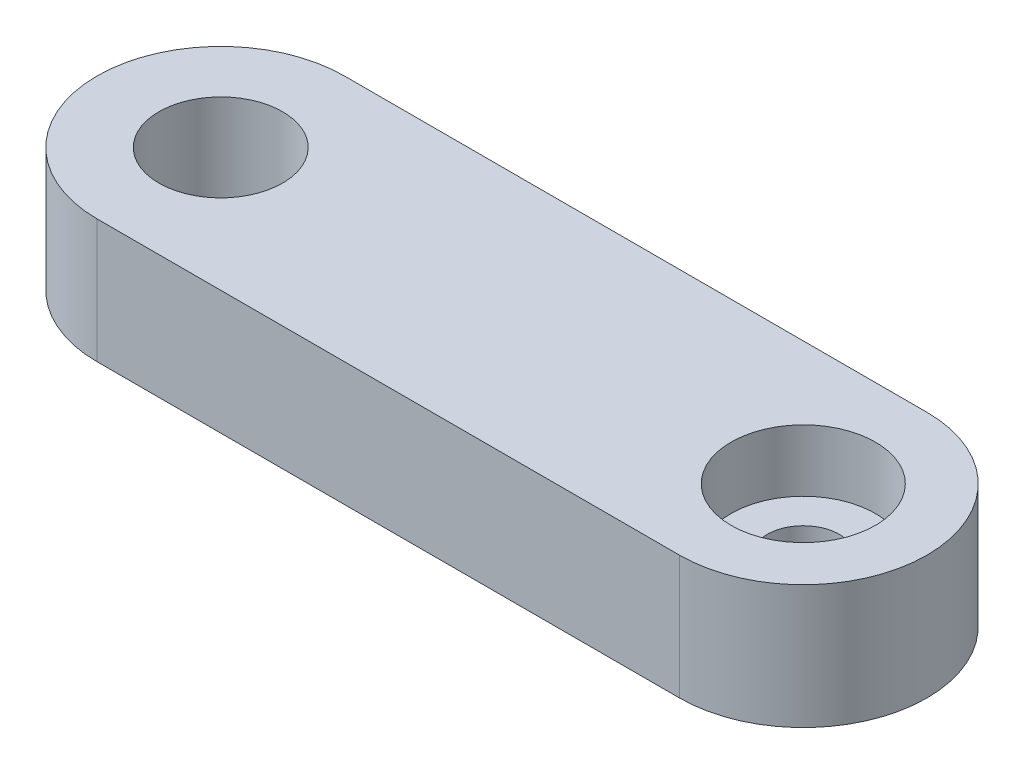
ISO-10303-21;
HEADER;
FILE_DESCRIPTION(('STEP AP214'),'2;1');
FILE_NAME('part.step','',(''),(''),'','','');
FILE_SCHEMA(('AUTOMOTIVE_DESIGN { 1 0 10303 214 1 1 1 1 }'));
ENDSEC;
DATA;
#1=APPLICATION_CONTEXT('core data for automotive mechanical design processes');
#2=APPLICATION_PROTOCOL_DEFINITION('international standard','automotive_design',2000,#1);
#3=PRODUCT_CONTEXT('',#1,'mechanical');
#4=PRODUCT('Part','Part','',(#3));
#5=PRODUCT_RELATED_PRODUCT_CATEGORY('part','',(#4));
#6=PRODUCT_DEFINITION_FORMATION('','',#4);
#7=PRODUCT_DEFINITION_CONTEXT('part definition',#1,'design');
#8=PRODUCT_DEFINITION('design','',#6,#7);
#9=PRODUCT_DEFINITION_SHAPE('','',#8);
#10=(LENGTH_UNIT() NAMED_UNIT(*) SI_UNIT(.MILLI.,.METRE.));
#11=(NAMED_UNIT(*) PLANE_ANGLE_UNIT() SI_UNIT($,.RADIAN.));
#12=(NAMED_UNIT(*) SI_UNIT($,.STERADIAN.) SOLID_ANGLE_UNIT());
#13=UNCERTAINTY_MEASURE_WITH_UNIT(LENGTH_MEASURE(1.E-05),#10,'distance_accuracy_value','');
#14=(GEOMETRIC_REPRESENTATION_CONTEXT(3) GLOBAL_UNCERTAINTY_ASSIGNED_CONTEXT((#13)) GLOBAL_UNIT_ASSIGNED_CONTEXT((#10,
#11,#12)) REPRESENTATION_CONTEXT('',''));
#15=CARTESIAN_POINT('',(0.,0.,0.));
#16=DIRECTION('',(0.,0.,1.));
#17=DIRECTION('',(1.,0.,0.));
#18=AXIS2_PLACEMENT_3D('',#15,#16,#17);
#19=CARTESIAN_POINT('',(0.,6.,0.));
#20=DIRECTION('',(0.,-1.,0.));
#21=DIRECTION('',(0.,0.,-1.));
#22=AXIS2_PLACEMENT_3D('',#19,#20,#21);
#23=CYLINDRICAL_SURFACE('',#22,1.75);
#24=CARTESIAN_POINT('',(0.,0.,0.));
#25=DIRECTION('',(0.,1.,0.));
#26=DIRECTION('',(0.,0.,1.));
#27=AXIS2_PLACEMENT_3D('',#24,#25,#26);
#28=CIRCLE('',#27,1.75);
#29=CARTESIAN_POINT('',(0.,0.,1.75));
#30=VERTEX_POINT('',#29);
#31=EDGE_CURVE('E102',#30,#30,#28,.T.);
#32=ORIENTED_EDGE('',*,*,#31,.F.);
#33=EDGE_LOOP('',(#32));
#34=FACE_BOUND('',#33,.T.);
#35=CARTESIAN_POINT('',(0.,3.,0.));
#36=DIRECTION('',(0.,1.,0.));
#37=DIRECTION('',(0.,0.,1.));
#38=AXIS2_PLACEMENT_3D('',#35,#36,#37);
#39=CIRCLE('',#38,1.75);
#40=CARTESIAN_POINT('',(0.,3.,1.75));
#41=VERTEX_POINT('',#40);
#42=EDGE_CURVE('E36',#41,#41,#39,.T.);
#43=ORIENTED_EDGE('',*,*,#42,.T.);
#44=EDGE_LOOP('',(#43));
#45=FACE_BOUND('',#44,.T.);
#46=ADVANCED_FACE('F32',(#34,#45),#23,.F.);
#47=CARTESIAN_POINT('',(0.,6.,0.));
#48=DIRECTION('',(0.,1.,0.));
#49=DIRECTION('',(0.,0.,1.));
#50=AXIS2_PLACEMENT_3D('',#47,#48,#49);
#51=PLANE('',#50);
#52=CARTESIAN_POINT('',(0.,6.,0.));
#53=DIRECTION('',(0.,1.,0.));
#54=DIRECTION('',(0.,0.,1.));
#55=AXIS2_PLACEMENT_3D('',#52,#53,#54);
#56=CIRCLE('',#55,3.5);
#57=CARTESIAN_POINT('',(0.,6.,3.5));
#58=VERTEX_POINT('',#57);
#59=EDGE_CURVE('E122',#58,#58,#56,.T.);
#60=ORIENTED_EDGE('',*,*,#59,.F.);
#61=EDGE_LOOP('',(#60));
#62=FACE_BOUND('',#61,.T.);
#63=CARTESIAN_POINT('',(0.,6.,0.));
#64=DIRECTION('',(0.,1.,0.));
#65=DIRECTION('',(0.,0.,1.));
#66=AXIS2_PLACEMENT_3D('',#63,#64,#65);
#67=CIRCLE('',#66,6.);
#68=CARTESIAN_POINT('',(0.,6.,6.));
#69=VERTEX_POINT('',#68);
#70=CARTESIAN_POINT('',(0.,6.,-6.));
#71=VERTEX_POINT('',#70);
#72=EDGE_CURVE('E86',#69,#71,#67,.T.);
#73=ORIENTED_EDGE('',*,*,#72,.T.);
#74=DIRECTION('',(-1.,0.,0.));
#75=VECTOR('',#74,1.);
#76=CARTESIAN_POINT('',(0.,6.,-6.));
#77=LINE('',#76,#75);
#78=CARTESIAN_POINT('',(-28.25,6.,-6.));
#79=VERTEX_POINT('',#78);
#80=EDGE_CURVE('E80',#71,#79,#77,.T.);
#81=ORIENTED_EDGE('',*,*,#80,.T.);
#82=CARTESIAN_POINT('',(-28.25,6.,0.));
#83=DIRECTION('',(0.,1.,0.));
#84=DIRECTION('',(0.,0.,1.));
#85=AXIS2_PLACEMENT_3D('',#82,#83,#84);
#86=CIRCLE('',#85,6.);
#87=CARTESIAN_POINT('',(-28.25,6.,6.));
#88=VERTEX_POINT('',#87);
#89=EDGE_CURVE('E84',#79,#88,#86,.T.);
#90=ORIENTED_EDGE('',*,*,#89,.T.);
#91=DIRECTION('',(1.,0.,0.));
#92=VECTOR('',#91,1.);
#93=CARTESIAN_POINT('',(0.,6.,6.));
#94=LINE('',#93,#92);
#95=EDGE_CURVE('E50',#88,#69,#94,.T.);
#96=ORIENTED_EDGE('',*,*,#95,.T.);
#97=EDGE_LOOP('',(#73,#81,#90,#96));
#98=FACE_BOUND('',#97,.T.);
#99=CARTESIAN_POINT('',(-28.25,6.,0.));
#100=DIRECTION('',(0.,1.,0.));
#101=DIRECTION('',(0.,0.,1.));
#102=AXIS2_PLACEMENT_3D('',#99,#100,#101);
#103=CIRCLE('',#102,3.);
#104=CARTESIAN_POINT('',(-28.25,6.,3.));
#105=VERTEX_POINT('',#104);
#106=EDGE_CURVE('E116',#105,#105,#103,.T.);
#107=ORIENTED_EDGE('',*,*,#106,.F.);
#108=EDGE_LOOP('',(#107));
#109=FACE_BOUND('',#108,.T.);
#110=ADVANCED_FACE('F81',(#62,#98,#109),#51,.T.);
#111=CARTESIAN_POINT('',(0.,0.,0.));
#112=DIRECTION('',(0.,1.,0.));
#113=DIRECTION('',(0.,0.,1.));
#114=AXIS2_PLACEMENT_3D('',#111,#112,#113);
#115=PLANE('',#114);
#116=ORIENTED_EDGE('',*,*,#31,.T.);
#117=EDGE_LOOP('',(#116));
#118=FACE_BOUND('',#117,.T.);
#119=CARTESIAN_POINT('',(0.,0.,0.));
#120=DIRECTION('',(0.,1.,0.));
#121=DIRECTION('',(0.,0.,1.));
#122=AXIS2_PLACEMENT_3D('',#119,#120,#121);
#123=CIRCLE('',#122,6.);
#124=CARTESIAN_POINT('',(0.,0.,6.));
#125=VERTEX_POINT('',#124);
#126=CARTESIAN_POINT('',(0.,0.,-6.));
#127=VERTEX_POINT('',#126);
#128=EDGE_CURVE('E99',#125,#127,#123,.T.);
#129=ORIENTED_EDGE('',*,*,#128,.F.);
#130=DIRECTION('',(1.,0.,0.));
#131=VECTOR('',#130,1.);
#132=CARTESIAN_POINT('',(0.,0.,6.));
#133=LINE('',#132,#131);
#134=CARTESIAN_POINT('',(-28.25,0.,6.));
#135=VERTEX_POINT('',#134);
#136=EDGE_CURVE('E73',#135,#125,#133,.T.);
#137=ORIENTED_EDGE('',*,*,#136,.F.);
#138=CARTESIAN_POINT('',(-28.25,0.,0.));
#139=DIRECTION('',(0.,1.,0.));
#140=DIRECTION('',(0.,0.,1.));
#141=AXIS2_PLACEMENT_3D('',#138,#139,#140);
#142=CIRCLE('',#141,6.);
#143=CARTESIAN_POINT('',(-28.25,0.,-6.));
#144=VERTEX_POINT('',#143);
#145=EDGE_CURVE('E67',#144,#135,#142,.T.);
#146=ORIENTED_EDGE('',*,*,#145,.F.);
#147=DIRECTION('',(-1.,0.,0.));
#148=VECTOR('',#147,1.);
#149=CARTESIAN_POINT('',(0.,0.,-6.));
#150=LINE('',#149,#148);
#151=EDGE_CURVE('E90',#127,#144,#150,.T.);
#152=ORIENTED_EDGE('',*,*,#151,.F.);
#153=EDGE_LOOP('',(#129,#137,#146,#152));
#154=FACE_BOUND('',#153,.T.);
#155=CARTESIAN_POINT('',(-28.25,0.,0.));
#156=DIRECTION('',(0.,1.,0.));
#157=DIRECTION('',(0.,0.,1.));
#158=AXIS2_PLACEMENT_3D('',#155,#156,#157);
#159=CIRCLE('',#158,3.);
#160=CARTESIAN_POINT('',(-28.25,0.,3.));
#161=VERTEX_POINT('',#160);
#162=EDGE_CURVE('E117',#161,#161,#159,.T.);
#163=ORIENTED_EDGE('',*,*,#162,.T.);
#164=EDGE_LOOP('',(#163));
#165=FACE_BOUND('',#164,.T.);
#166=ADVANCED_FACE('F110',(#118,#154,#165),#115,.F.);
#167=CARTESIAN_POINT('',(0.,6.,0.));
#168=DIRECTION('',(0.,-1.,0.));
#169=DIRECTION('',(0.,0.,-1.));
#170=AXIS2_PLACEMENT_3D('',#167,#168,#169);
#171=CYLINDRICAL_SURFACE('',#170,6.);
#172=ORIENTED_EDGE('',*,*,#128,.T.);
#173=DIRECTION('',(0.,-1.,0.));
#174=VECTOR('',#173,1.);
#175=CARTESIAN_POINT('',(0.,6.,-6.));
#176=LINE('',#175,#174);
#177=EDGE_CURVE('E11',#71,#127,#176,.T.);
#178=ORIENTED_EDGE('',*,*,#177,.F.);
#179=ORIENTED_EDGE('',*,*,#72,.F.);
#180=DIRECTION('',(0.,-1.,0.));
#181=VECTOR('',#180,1.);
#182=CARTESIAN_POINT('',(0.,6.,6.));
#183=LINE('',#182,#181);
#184=EDGE_CURVE('E95',#69,#125,#183,.T.);
#185=ORIENTED_EDGE('',*,*,#184,.T.);
#186=EDGE_LOOP('',(#172,#178,#179,#185));
#187=FACE_BOUND('',#186,.T.);
#188=ADVANCED_FACE('F34',(#187),#171,.T.);
#189=CARTESIAN_POINT('',(0.,6.,-6.));
#190=DIRECTION('',(0.,0.,1.));
#191=DIRECTION('',(1.,0.,0.));
#192=AXIS2_PLACEMENT_3D('',#189,#190,#191);
#193=PLANE('',#192);
#194=ORIENTED_EDGE('',*,*,#151,.T.);
#195=DIRECTION('',(0.,-1.,0.));
#196=VECTOR('',#195,1.);
#197=CARTESIAN_POINT('',(-28.25,6.,-6.));
#198=LINE('',#197,#196);
#199=EDGE_CURVE('E42',#79,#144,#198,.T.);
#200=ORIENTED_EDGE('',*,*,#199,.F.);
#201=ORIENTED_EDGE('',*,*,#80,.F.);
#202=ORIENTED_EDGE('',*,*,#177,.T.);
#203=EDGE_LOOP('',(#194,#200,#201,#202));
#204=FACE_BOUND('',#203,.T.);
#205=ADVANCED_FACE('F89',(#204),#193,.F.);
#206=CARTESIAN_POINT('',(-28.25,6.,0.));
#207=DIRECTION('',(0.,-1.,0.));
#208=DIRECTION('',(0.,0.,-1.));
#209=AXIS2_PLACEMENT_3D('',#206,#207,#208);
#210=CYLINDRICAL_SURFACE('',#209,6.);
#211=ORIENTED_EDGE('',*,*,#145,.T.);
#212=DIRECTION('',(0.,-1.,0.));
#213=VECTOR('',#212,1.);
#214=CARTESIAN_POINT('',(-28.25,6.,6.));
#215=LINE('',#214,#213);
#216=EDGE_CURVE('E91',#88,#135,#215,.T.);
#217=ORIENTED_EDGE('',*,*,#216,.F.);
#218=ORIENTED_EDGE('',*,*,#89,.F.);
#219=ORIENTED_EDGE('',*,*,#199,.T.);
#220=EDGE_LOOP('',(#211,#217,#218,#219));
#221=FACE_BOUND('',#220,.T.);
#222=ADVANCED_FACE('F93',(#221),#210,.T.);
#223=CARTESIAN_POINT('',(0.,6.,6.));
#224=DIRECTION('',(0.,0.,-1.));
#225=DIRECTION('',(-1.,0.,0.));
#226=AXIS2_PLACEMENT_3D('',#223,#224,#225);
#227=PLANE('',#226);
#228=ORIENTED_EDGE('',*,*,#136,.T.);
#229=ORIENTED_EDGE('',*,*,#184,.F.);
#230=ORIENTED_EDGE('',*,*,#95,.F.);
#231=ORIENTED_EDGE('',*,*,#216,.T.);
#232=EDGE_LOOP('',(#228,#229,#230,#231));
#233=FACE_BOUND('',#232,.T.);
#234=ADVANCED_FACE('F107',(#233),#227,.F.);
#235=CARTESIAN_POINT('',(-28.25,6.,0.));
#236=DIRECTION('',(0.,-1.,0.));
#237=DIRECTION('',(0.,0.,-1.));
#238=AXIS2_PLACEMENT_3D('',#235,#236,#237);
#239=CYLINDRICAL_SURFACE('',#238,3.);
#240=ORIENTED_EDGE('',*,*,#106,.T.);
#241=EDGE_LOOP('',(#240));
#242=FACE_BOUND('',#241,.T.);
#243=ORIENTED_EDGE('',*,*,#162,.F.);
#244=EDGE_LOOP('',(#243));
#245=FACE_BOUND('',#244,.T.);
#246=ADVANCED_FACE('F140',(#242,#245),#239,.F.);
#247=CARTESIAN_POINT('',(0.,3.,0.));
#248=DIRECTION('',(0.,1.,0.));
#249=DIRECTION('',(0.,0.,1.));
#250=AXIS2_PLACEMENT_3D('',#247,#248,#249);
#251=CYLINDRICAL_SURFACE('',#250,3.5);
#252=CARTESIAN_POINT('',(0.,3.,0.));
#253=DIRECTION('',(0.,1.,0.));
#254=DIRECTION('',(0.,0.,1.));
#255=AXIS2_PLACEMENT_3D('',#252,#253,#254);
#256=CIRCLE('',#255,3.5);
#257=CARTESIAN_POINT('',(0.,3.,3.5));
#258=VERTEX_POINT('',#257);
#259=EDGE_CURVE('E125',#258,#258,#256,.T.);
#260=ORIENTED_EDGE('',*,*,#259,.F.);
#261=EDGE_LOOP('',(#260));
#262=FACE_BOUND('',#261,.T.);
#263=ORIENTED_EDGE('',*,*,#59,.T.);
#264=EDGE_LOOP('',(#263));
#265=FACE_BOUND('',#264,.T.);
#266=ADVANCED_FACE('F135',(#262,#265),#251,.F.);
#267=CARTESIAN_POINT('',(0.,3.,0.));
#268=DIRECTION('',(0.,1.,0.));
#269=DIRECTION('',(0.,0.,1.));
#270=AXIS2_PLACEMENT_3D('',#267,#268,#269);
#271=PLANE('',#270);
#272=ORIENTED_EDGE('',*,*,#42,.F.);
#273=EDGE_LOOP('',(#272));
#274=FACE_BOUND('',#273,.T.);
#275=ORIENTED_EDGE('',*,*,#259,.T.);
#276=EDGE_LOOP('',(#275));
#277=FACE_BOUND('',#276,.T.);
#278=ADVANCED_FACE('F133',(#274,#277),#271,.T.);
#279=CLOSED_SHELL('',(#46,#110,#166,#188,#205,#222,#234,#246,#266,#278));
#280=MANIFOLD_SOLID_BREP('B2',#279);
#281=ADVANCED_BREP_SHAPE_REPRESENTATION('',(#18,#280),#14);
#282=SHAPE_DEFINITION_REPRESENTATION(#9,#281);
ENDSEC;
END-ISO-10303-21;
